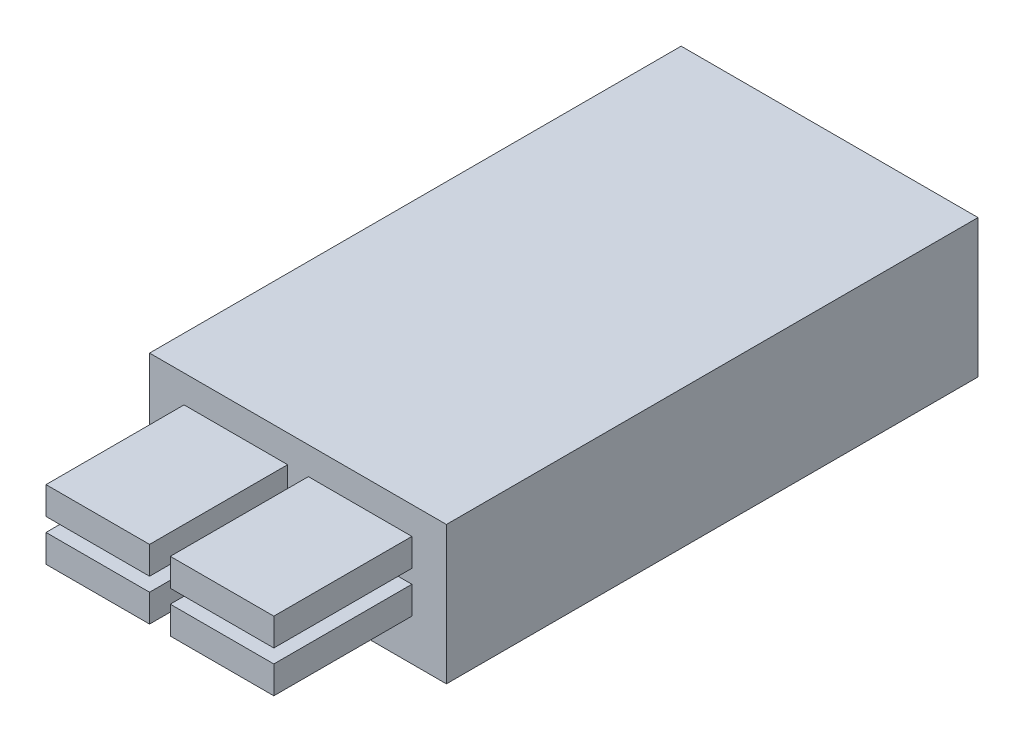
ISO-10303-21;
HEADER;
FILE_DESCRIPTION(('STEP AP214'),'2;1');
FILE_NAME('part.step','',(''),(''),'','','');
FILE_SCHEMA(('AUTOMOTIVE_DESIGN { 1 0 10303 214 1 1 1 1 }'));
ENDSEC;
DATA;
#1=APPLICATION_CONTEXT('core data for automotive mechanical design processes');
#2=APPLICATION_PROTOCOL_DEFINITION('international standard','automotive_design',2000,#1);
#3=PRODUCT_CONTEXT('',#1,'mechanical');
#4=PRODUCT('Part','Part','',(#3));
#5=PRODUCT_RELATED_PRODUCT_CATEGORY('part','',(#4));
#6=PRODUCT_DEFINITION_FORMATION('','',#4);
#7=PRODUCT_DEFINITION_CONTEXT('part definition',#1,'design');
#8=PRODUCT_DEFINITION('design','',#6,#7);
#9=PRODUCT_DEFINITION_SHAPE('','',#8);
#10=(LENGTH_UNIT() NAMED_UNIT(*) SI_UNIT(.MILLI.,.METRE.));
#11=(NAMED_UNIT(*) PLANE_ANGLE_UNIT() SI_UNIT($,.RADIAN.));
#12=(NAMED_UNIT(*) SI_UNIT($,.STERADIAN.) SOLID_ANGLE_UNIT());
#13=UNCERTAINTY_MEASURE_WITH_UNIT(LENGTH_MEASURE(1.E-05),#10,'distance_accuracy_value','');
#14=(GEOMETRIC_REPRESENTATION_CONTEXT(3) GLOBAL_UNCERTAINTY_ASSIGNED_CONTEXT((#13)) GLOBAL_UNIT_ASSIGNED_CONTEXT((#10,
#11,#12)) REPRESENTATION_CONTEXT('',''));
#15=CARTESIAN_POINT('',(0.,0.,0.));
#16=DIRECTION('',(0.,0.,1.));
#17=DIRECTION('',(1.,0.,0.));
#18=AXIS2_PLACEMENT_3D('',#15,#16,#17);
#19=CARTESIAN_POINT('',(-10.75,10.,19.25));
#20=DIRECTION('',(0.,0.,-1.));
#21=DIRECTION('',(-1.,0.,0.));
#22=AXIS2_PLACEMENT_3D('',#19,#20,#21);
#23=PLANE('',#22);
#24=DIRECTION('',(-1.,0.,0.));
#25=VECTOR('',#24,1.);
#26=CARTESIAN_POINT('',(8.25,4.99999999999999,19.25));
#27=LINE('',#26,#25);
#28=CARTESIAN_POINT('',(8.25,4.99999999999999,19.25));
#29=VERTEX_POINT('',#28);
#30=CARTESIAN_POINT('',(0.750000000000006,5.,19.25));
#31=VERTEX_POINT('',#30);
#32=EDGE_CURVE('E190',#29,#31,#27,.T.);
#33=ORIENTED_EDGE('',*,*,#32,.F.);
#34=DIRECTION('',(0.,1.,0.));
#35=VECTOR('',#34,1.);
#36=CARTESIAN_POINT('',(8.25,4.99999999999999,19.25));
#37=LINE('',#36,#35);
#38=CARTESIAN_POINT('',(8.25,2.99999999999999,19.25));
#39=VERTEX_POINT('',#38);
#40=EDGE_CURVE('E203',#39,#29,#37,.T.);
#41=ORIENTED_EDGE('',*,*,#40,.F.);
#42=DIRECTION('',(1.,0.,0.));
#43=VECTOR('',#42,1.);
#44=CARTESIAN_POINT('',(8.25,2.99999999999999,19.25));
#45=LINE('',#44,#43);
#46=CARTESIAN_POINT('',(0.750000000000002,3.,19.25));
#47=VERTEX_POINT('',#46);
#48=EDGE_CURVE('E212',#47,#39,#45,.T.);
#49=ORIENTED_EDGE('',*,*,#48,.F.);
#50=DIRECTION('',(0.,-1.,0.));
#51=VECTOR('',#50,1.);
#52=CARTESIAN_POINT('',(0.750000000000005,5.,19.25));
#53=LINE('',#52,#51);
#54=EDGE_CURVE('E193',#31,#47,#53,.T.);
#55=ORIENTED_EDGE('',*,*,#54,.F.);
#56=EDGE_LOOP('',(#33,#41,#49,#55));
#57=FACE_BOUND('',#56,.T.);
#58=DIRECTION('',(0.,1.,0.));
#59=VECTOR('',#58,1.);
#60=CARTESIAN_POINT('',(-0.75,8.,19.25));
#61=LINE('',#60,#59);
#62=CARTESIAN_POINT('',(-0.75,6.,19.25));
#63=VERTEX_POINT('',#62);
#64=CARTESIAN_POINT('',(-0.749999999999999,8.,19.25));
#65=VERTEX_POINT('',#64);
#66=EDGE_CURVE('E261',#63,#65,#61,.T.);
#67=ORIENTED_EDGE('',*,*,#66,.F.);
#68=DIRECTION('',(1.,0.,0.));
#69=VECTOR('',#68,1.);
#70=CARTESIAN_POINT('',(-8.25,6.,19.25));
#71=LINE('',#70,#69);
#72=CARTESIAN_POINT('',(-8.25,6.,19.25));
#73=VERTEX_POINT('',#72);
#74=EDGE_CURVE('E266',#73,#63,#71,.T.);
#75=ORIENTED_EDGE('',*,*,#74,.F.);
#76=DIRECTION('',(0.,-1.,0.));
#77=VECTOR('',#76,1.);
#78=CARTESIAN_POINT('',(-8.25,8.,19.25));
#79=LINE('',#78,#77);
#80=CARTESIAN_POINT('',(-8.25,8.,19.25));
#81=VERTEX_POINT('',#80);
#82=EDGE_CURVE('E278',#81,#73,#79,.T.);
#83=ORIENTED_EDGE('',*,*,#82,.F.);
#84=DIRECTION('',(-1.,0.,0.));
#85=VECTOR('',#84,1.);
#86=CARTESIAN_POINT('',(-8.25,8.,19.25));
#87=LINE('',#86,#85);
#88=EDGE_CURVE('E275',#65,#81,#87,.T.);
#89=ORIENTED_EDGE('',*,*,#88,.F.);
#90=EDGE_LOOP('',(#67,#75,#83,#89));
#91=FACE_BOUND('',#90,.T.);
#92=DIRECTION('',(1.,0.,0.));
#93=VECTOR('',#92,1.);
#94=CARTESIAN_POINT('',(-10.75,0.,19.25));
#95=LINE('',#94,#93);
#96=CARTESIAN_POINT('',(-10.75,0.,19.25));
#97=VERTEX_POINT('',#96);
#98=CARTESIAN_POINT('',(10.75,0.,19.25));
#99=VERTEX_POINT('',#98);
#100=EDGE_CURVE('E299',#97,#99,#95,.T.);
#101=ORIENTED_EDGE('',*,*,#100,.T.);
#102=DIRECTION('',(0.,-1.,0.));
#103=VECTOR('',#102,1.);
#104=CARTESIAN_POINT('',(10.75,10.,19.25));
#105=LINE('',#104,#103);
#106=CARTESIAN_POINT('',(10.75,10.,19.25));
#107=VERTEX_POINT('',#106);
#108=EDGE_CURVE('E305',#107,#99,#105,.T.);
#109=ORIENTED_EDGE('',*,*,#108,.F.);
#110=DIRECTION('',(1.,0.,0.));
#111=VECTOR('',#110,1.);
#112=CARTESIAN_POINT('',(-10.75,10.,19.25));
#113=LINE('',#112,#111);
#114=CARTESIAN_POINT('',(-10.75,10.,19.25));
#115=VERTEX_POINT('',#114);
#116=EDGE_CURVE('E303',#115,#107,#113,.T.);
#117=ORIENTED_EDGE('',*,*,#116,.F.);
#118=DIRECTION('',(0.,-1.,0.));
#119=VECTOR('',#118,1.);
#120=CARTESIAN_POINT('',(-10.75,10.,19.25));
#121=LINE('',#120,#119);
#122=EDGE_CURVE('E315',#115,#97,#121,.T.);
#123=ORIENTED_EDGE('',*,*,#122,.T.);
#124=EDGE_LOOP('',(#101,#109,#117,#123));
#125=FACE_BOUND('',#124,.T.);
#126=DIRECTION('',(0.,1.,0.));
#127=VECTOR('',#126,1.);
#128=CARTESIAN_POINT('',(-0.75,5.,19.25));
#129=LINE('',#128,#127);
#130=CARTESIAN_POINT('',(-0.75,3.,19.25));
#131=VERTEX_POINT('',#130);
#132=CARTESIAN_POINT('',(-0.749999999999999,5.,19.25));
#133=VERTEX_POINT('',#132);
#134=EDGE_CURVE('E228',#131,#133,#129,.T.);
#135=ORIENTED_EDGE('',*,*,#134,.F.);
#136=DIRECTION('',(1.,0.,0.));
#137=VECTOR('',#136,1.);
#138=CARTESIAN_POINT('',(-8.25,3.,19.25));
#139=LINE('',#138,#137);
#140=CARTESIAN_POINT('',(-8.25,3.,19.25));
#141=VERTEX_POINT('',#140);
#142=EDGE_CURVE('E233',#141,#131,#139,.T.);
#143=ORIENTED_EDGE('',*,*,#142,.F.);
#144=DIRECTION('',(0.,-1.,0.));
#145=VECTOR('',#144,1.);
#146=CARTESIAN_POINT('',(-8.25,5.,19.25));
#147=LINE('',#146,#145);
#148=CARTESIAN_POINT('',(-8.25,5.,19.25));
#149=VERTEX_POINT('',#148);
#150=EDGE_CURVE('E245',#149,#141,#147,.T.);
#151=ORIENTED_EDGE('',*,*,#150,.F.);
#152=DIRECTION('',(-1.,0.,0.));
#153=VECTOR('',#152,1.);
#154=CARTESIAN_POINT('',(-8.25,5.,19.25));
#155=LINE('',#154,#153);
#156=EDGE_CURVE('E242',#133,#149,#155,.T.);
#157=ORIENTED_EDGE('',*,*,#156,.F.);
#158=EDGE_LOOP('',(#135,#143,#151,#157));
#159=FACE_BOUND('',#158,.T.);
#160=DIRECTION('',(-1.,0.,0.));
#161=VECTOR('',#160,1.);
#162=CARTESIAN_POINT('',(8.25000000000001,7.99999999999999,19.25));
#163=LINE('',#162,#161);
#164=CARTESIAN_POINT('',(8.25000000000001,7.99999999999999,19.25));
#165=VERTEX_POINT('',#164);
#166=CARTESIAN_POINT('',(0.750000000000007,8.,19.25));
#167=VERTEX_POINT('',#166);
#168=EDGE_CURVE('E189',#165,#167,#163,.T.);
#169=ORIENTED_EDGE('',*,*,#168,.F.);
#170=DIRECTION('',(0.,1.,0.));
#171=VECTOR('',#170,1.);
#172=CARTESIAN_POINT('',(8.25000000000001,7.99999999999999,19.25));
#173=LINE('',#172,#171);
#174=CARTESIAN_POINT('',(8.25000000000001,5.99999999999999,19.25));
#175=VERTEX_POINT('',#174);
#176=EDGE_CURVE('E186',#175,#165,#173,.T.);
#177=ORIENTED_EDGE('',*,*,#176,.F.);
#178=DIRECTION('',(1.,0.,0.));
#179=VECTOR('',#178,1.);
#180=CARTESIAN_POINT('',(8.25000000000001,5.99999999999999,19.25));
#181=LINE('',#180,#179);
#182=CARTESIAN_POINT('',(0.750000000000006,6.,19.25));
#183=VERTEX_POINT('',#182);
#184=EDGE_CURVE('E52',#183,#175,#181,.T.);
#185=ORIENTED_EDGE('',*,*,#184,.F.);
#186=DIRECTION('',(0.,-1.,0.));
#187=VECTOR('',#186,1.);
#188=CARTESIAN_POINT('',(0.750000000000008,8.,19.25));
#189=LINE('',#188,#187);
#190=EDGE_CURVE('E47',#167,#183,#189,.T.);
#191=ORIENTED_EDGE('',*,*,#190,.F.);
#192=EDGE_LOOP('',(#169,#177,#185,#191));
#193=FACE_BOUND('',#192,.T.);
#194=ADVANCED_FACE('F32',(#57,#91,#125,#159,#193),#23,.F.);
#195=CARTESIAN_POINT('',(10.75,10.,-19.25));
#196=DIRECTION('',(-1.,0.,0.));
#197=DIRECTION('',(0.,0.,1.));
#198=AXIS2_PLACEMENT_3D('',#195,#196,#197);
#199=PLANE('',#198);
#200=DIRECTION('',(0.,0.,-1.));
#201=VECTOR('',#200,1.);
#202=CARTESIAN_POINT('',(10.75,0.,-19.25));
#203=LINE('',#202,#201);
#204=CARTESIAN_POINT('',(10.75,0.,-19.25));
#205=VERTEX_POINT('',#204);
#206=EDGE_CURVE('E294',#99,#205,#203,.T.);
#207=ORIENTED_EDGE('',*,*,#206,.T.);
#208=DIRECTION('',(0.,-1.,0.));
#209=VECTOR('',#208,1.);
#210=CARTESIAN_POINT('',(10.75,10.,-19.25));
#211=LINE('',#210,#209);
#212=CARTESIAN_POINT('',(10.75,10.,-19.25));
#213=VERTEX_POINT('',#212);
#214=EDGE_CURVE('E11',#213,#205,#211,.T.);
#215=ORIENTED_EDGE('',*,*,#214,.F.);
#216=DIRECTION('',(0.,0.,-1.));
#217=VECTOR('',#216,1.);
#218=CARTESIAN_POINT('',(10.75,10.,-19.25));
#219=LINE('',#218,#217);
#220=EDGE_CURVE('E295',#107,#213,#219,.T.);
#221=ORIENTED_EDGE('',*,*,#220,.F.);
#222=ORIENTED_EDGE('',*,*,#108,.T.);
#223=EDGE_LOOP('',(#207,#215,#221,#222));
#224=FACE_BOUND('',#223,.T.);
#225=ADVANCED_FACE('F34',(#224),#199,.F.);
#226=CARTESIAN_POINT('',(-10.75,10.,-19.25));
#227=DIRECTION('',(0.,0.,1.));
#228=DIRECTION('',(1.,0.,0.));
#229=AXIS2_PLACEMENT_3D('',#226,#227,#228);
#230=PLANE('',#229);
#231=DIRECTION('',(-1.,0.,0.));
#232=VECTOR('',#231,1.);
#233=CARTESIAN_POINT('',(-10.75,0.,-19.25));
#234=LINE('',#233,#232);
#235=CARTESIAN_POINT('',(-10.75,0.,-19.25));
#236=VERTEX_POINT('',#235);
#237=EDGE_CURVE('E308',#205,#236,#234,.T.);
#238=ORIENTED_EDGE('',*,*,#237,.T.);
#239=DIRECTION('',(0.,-1.,0.));
#240=VECTOR('',#239,1.);
#241=CARTESIAN_POINT('',(-10.75,10.,-19.25));
#242=LINE('',#241,#240);
#243=CARTESIAN_POINT('',(-10.75,10.,-19.25));
#244=VERTEX_POINT('',#243);
#245=EDGE_CURVE('E40',#244,#236,#242,.T.);
#246=ORIENTED_EDGE('',*,*,#245,.F.);
#247=DIRECTION('',(-1.,0.,0.));
#248=VECTOR('',#247,1.);
#249=CARTESIAN_POINT('',(-10.75,10.,-19.25));
#250=LINE('',#249,#248);
#251=EDGE_CURVE('E298',#213,#244,#250,.T.);
#252=ORIENTED_EDGE('',*,*,#251,.F.);
#253=ORIENTED_EDGE('',*,*,#214,.T.);
#254=EDGE_LOOP('',(#238,#246,#252,#253));
#255=FACE_BOUND('',#254,.T.);
#256=ADVANCED_FACE('F338',(#255),#230,.F.);
#257=CARTESIAN_POINT('',(-10.75,10.,-19.25));
#258=DIRECTION('',(1.,0.,0.));
#259=DIRECTION('',(0.,0.,-1.));
#260=AXIS2_PLACEMENT_3D('',#257,#258,#259);
#261=PLANE('',#260);
#262=DIRECTION('',(0.,0.,1.));
#263=VECTOR('',#262,1.);
#264=CARTESIAN_POINT('',(-10.75,0.,-19.25));
#265=LINE('',#264,#263);
#266=EDGE_CURVE('E310',#236,#97,#265,.T.);
#267=ORIENTED_EDGE('',*,*,#266,.T.);
#268=ORIENTED_EDGE('',*,*,#122,.F.);
#269=DIRECTION('',(0.,0.,1.));
#270=VECTOR('',#269,1.);
#271=CARTESIAN_POINT('',(-10.75,10.,-19.25));
#272=LINE('',#271,#270);
#273=EDGE_CURVE('E301',#244,#115,#272,.T.);
#274=ORIENTED_EDGE('',*,*,#273,.F.);
#275=ORIENTED_EDGE('',*,*,#245,.T.);
#276=EDGE_LOOP('',(#267,#268,#274,#275));
#277=FACE_BOUND('',#276,.T.);
#278=ADVANCED_FACE('F322',(#277),#261,.F.);
#279=CARTESIAN_POINT('',(0.,10.,0.));
#280=DIRECTION('',(0.,1.,0.));
#281=DIRECTION('',(0.,0.,1.));
#282=AXIS2_PLACEMENT_3D('',#279,#280,#281);
#283=PLANE('',#282);
#284=ORIENTED_EDGE('',*,*,#220,.T.);
#285=ORIENTED_EDGE('',*,*,#251,.T.);
#286=ORIENTED_EDGE('',*,*,#273,.T.);
#287=ORIENTED_EDGE('',*,*,#116,.T.);
#288=EDGE_LOOP('',(#284,#285,#286,#287));
#289=FACE_BOUND('',#288,.T.);
#290=ADVANCED_FACE('F337',(#289),#283,.T.);
#291=CARTESIAN_POINT('',(0.,0.,0.));
#292=DIRECTION('',(0.,1.,0.));
#293=DIRECTION('',(0.,0.,1.));
#294=AXIS2_PLACEMENT_3D('',#291,#292,#293);
#295=PLANE('',#294);
#296=ORIENTED_EDGE('',*,*,#206,.F.);
#297=ORIENTED_EDGE('',*,*,#100,.F.);
#298=ORIENTED_EDGE('',*,*,#266,.F.);
#299=ORIENTED_EDGE('',*,*,#237,.F.);
#300=EDGE_LOOP('',(#296,#297,#298,#299));
#301=FACE_BOUND('',#300,.T.);
#302=ADVANCED_FACE('F328',(#301),#295,.F.);
#303=CARTESIAN_POINT('',(-0.75,8.,29.25));
#304=DIRECTION('',(-1.,0.,0.));
#305=DIRECTION('',(0.,0.,1.));
#306=AXIS2_PLACEMENT_3D('',#303,#304,#305);
#307=PLANE('',#306);
#308=ORIENTED_EDGE('',*,*,#66,.T.);
#309=DIRECTION('',(0.,0.,-1.));
#310=VECTOR('',#309,1.);
#311=CARTESIAN_POINT('',(-0.75,8.,29.25));
#312=LINE('',#311,#310);
#313=CARTESIAN_POINT('',(-0.75,8.,29.25));
#314=VERTEX_POINT('',#313);
#315=EDGE_CURVE('E291',#314,#65,#312,.T.);
#316=ORIENTED_EDGE('',*,*,#315,.F.);
#317=DIRECTION('',(0.,1.,0.));
#318=VECTOR('',#317,1.);
#319=CARTESIAN_POINT('',(-0.75,8.,29.25));
#320=LINE('',#319,#318);
#321=CARTESIAN_POINT('',(-0.75,6.,29.25));
#322=VERTEX_POINT('',#321);
#323=EDGE_CURVE('E262',#322,#314,#320,.T.);
#324=ORIENTED_EDGE('',*,*,#323,.F.);
#325=DIRECTION('',(0.,0.,-1.));
#326=VECTOR('',#325,1.);
#327=CARTESIAN_POINT('',(-0.75,6.,29.25));
#328=LINE('',#327,#326);
#329=EDGE_CURVE('E272',#322,#63,#328,.T.);
#330=ORIENTED_EDGE('',*,*,#329,.T.);
#331=EDGE_LOOP('',(#308,#316,#324,#330));
#332=FACE_BOUND('',#331,.T.);
#333=ADVANCED_FACE('F354',(#332),#307,.F.);
#334=CARTESIAN_POINT('',(-8.25,8.,29.25));
#335=DIRECTION('',(0.,-1.,0.));
#336=DIRECTION('',(0.,0.,-1.));
#337=AXIS2_PLACEMENT_3D('',#334,#335,#336);
#338=PLANE('',#337);
#339=ORIENTED_EDGE('',*,*,#88,.T.);
#340=DIRECTION('',(0.,0.,-1.));
#341=VECTOR('',#340,1.);
#342=CARTESIAN_POINT('',(-8.25,8.,29.25));
#343=LINE('',#342,#341);
#344=CARTESIAN_POINT('',(-8.25,8.,29.25));
#345=VERTEX_POINT('',#344);
#346=EDGE_CURVE('E288',#345,#81,#343,.T.);
#347=ORIENTED_EDGE('',*,*,#346,.F.);
#348=DIRECTION('',(-1.,0.,0.));
#349=VECTOR('',#348,1.);
#350=CARTESIAN_POINT('',(-8.25,8.,29.25));
#351=LINE('',#350,#349);
#352=EDGE_CURVE('E265',#314,#345,#351,.T.);
#353=ORIENTED_EDGE('',*,*,#352,.F.);
#354=ORIENTED_EDGE('',*,*,#315,.T.);
#355=EDGE_LOOP('',(#339,#347,#353,#354));
#356=FACE_BOUND('',#355,.T.);
#357=ADVANCED_FACE('F359',(#356),#338,.F.);
#358=CARTESIAN_POINT('',(-8.25,8.,29.25));
#359=DIRECTION('',(1.,0.,0.));
#360=DIRECTION('',(0.,0.,-1.));
#361=AXIS2_PLACEMENT_3D('',#358,#359,#360);
#362=PLANE('',#361);
#363=ORIENTED_EDGE('',*,*,#82,.T.);
#364=DIRECTION('',(0.,0.,-1.));
#365=VECTOR('',#364,1.);
#366=CARTESIAN_POINT('',(-8.25,6.,29.25));
#367=LINE('',#366,#365);
#368=CARTESIAN_POINT('',(-8.25,6.,29.25));
#369=VERTEX_POINT('',#368);
#370=EDGE_CURVE('E285',#369,#73,#367,.T.);
#371=ORIENTED_EDGE('',*,*,#370,.F.);
#372=DIRECTION('',(0.,-1.,0.));
#373=VECTOR('',#372,1.);
#374=CARTESIAN_POINT('',(-8.25,8.,29.25));
#375=LINE('',#374,#373);
#376=EDGE_CURVE('E268',#345,#369,#375,.T.);
#377=ORIENTED_EDGE('',*,*,#376,.F.);
#378=ORIENTED_EDGE('',*,*,#346,.T.);
#379=EDGE_LOOP('',(#363,#371,#377,#378));
#380=FACE_BOUND('',#379,.T.);
#381=ADVANCED_FACE('F363',(#380),#362,.F.);
#382=CARTESIAN_POINT('',(-8.25,6.,29.25));
#383=DIRECTION('',(0.,1.,0.));
#384=DIRECTION('',(0.,0.,1.));
#385=AXIS2_PLACEMENT_3D('',#382,#383,#384);
#386=PLANE('',#385);
#387=ORIENTED_EDGE('',*,*,#74,.T.);
#388=ORIENTED_EDGE('',*,*,#329,.F.);
#389=DIRECTION('',(1.,0.,0.));
#390=VECTOR('',#389,1.);
#391=CARTESIAN_POINT('',(-8.25,6.,29.25));
#392=LINE('',#391,#390);
#393=EDGE_CURVE('E270',#369,#322,#392,.T.);
#394=ORIENTED_EDGE('',*,*,#393,.F.);
#395=ORIENTED_EDGE('',*,*,#370,.T.);
#396=EDGE_LOOP('',(#387,#388,#394,#395));
#397=FACE_BOUND('',#396,.T.);
#398=ADVANCED_FACE('F367',(#397),#386,.F.);
#399=CARTESIAN_POINT('',(0.,0.,29.25));
#400=DIRECTION('',(0.,0.,1.));
#401=DIRECTION('',(1.,0.,0.));
#402=AXIS2_PLACEMENT_3D('',#399,#400,#401);
#403=PLANE('',#402);
#404=ORIENTED_EDGE('',*,*,#323,.T.);
#405=ORIENTED_EDGE('',*,*,#352,.T.);
#406=ORIENTED_EDGE('',*,*,#376,.T.);
#407=ORIENTED_EDGE('',*,*,#393,.T.);
#408=EDGE_LOOP('',(#404,#405,#406,#407));
#409=FACE_BOUND('',#408,.T.);
#410=ADVANCED_FACE('F371',(#409),#403,.T.);
#411=CARTESIAN_POINT('',(-0.75,5.,29.25));
#412=DIRECTION('',(-1.,0.,0.));
#413=DIRECTION('',(0.,0.,1.));
#414=AXIS2_PLACEMENT_3D('',#411,#412,#413);
#415=PLANE('',#414);
#416=ORIENTED_EDGE('',*,*,#134,.T.);
#417=DIRECTION('',(0.,0.,-1.));
#418=VECTOR('',#417,1.);
#419=CARTESIAN_POINT('',(-0.75,5.,29.25));
#420=LINE('',#419,#418);
#421=CARTESIAN_POINT('',(-0.75,5.,29.25));
#422=VERTEX_POINT('',#421);
#423=EDGE_CURVE('E258',#422,#133,#420,.T.);
#424=ORIENTED_EDGE('',*,*,#423,.F.);
#425=DIRECTION('',(0.,1.,0.));
#426=VECTOR('',#425,1.);
#427=CARTESIAN_POINT('',(-0.75,5.,29.25));
#428=LINE('',#427,#426);
#429=CARTESIAN_POINT('',(-0.75,3.,29.25));
#430=VERTEX_POINT('',#429);
#431=EDGE_CURVE('E229',#430,#422,#428,.T.);
#432=ORIENTED_EDGE('',*,*,#431,.F.);
#433=DIRECTION('',(0.,0.,-1.));
#434=VECTOR('',#433,1.);
#435=CARTESIAN_POINT('',(-0.75,3.,29.25));
#436=LINE('',#435,#434);
#437=EDGE_CURVE('E239',#430,#131,#436,.T.);
#438=ORIENTED_EDGE('',*,*,#437,.T.);
#439=EDGE_LOOP('',(#416,#424,#432,#438));
#440=FACE_BOUND('',#439,.T.);
#441=ADVANCED_FACE('F375',(#440),#415,.F.);
#442=CARTESIAN_POINT('',(-8.25,5.,29.25));
#443=DIRECTION('',(0.,-1.,0.));
#444=DIRECTION('',(0.,0.,-1.));
#445=AXIS2_PLACEMENT_3D('',#442,#443,#444);
#446=PLANE('',#445);
#447=ORIENTED_EDGE('',*,*,#156,.T.);
#448=DIRECTION('',(0.,0.,-1.));
#449=VECTOR('',#448,1.);
#450=CARTESIAN_POINT('',(-8.25,5.,29.25));
#451=LINE('',#450,#449);
#452=CARTESIAN_POINT('',(-8.25,5.,29.25));
#453=VERTEX_POINT('',#452);
#454=EDGE_CURVE('E255',#453,#149,#451,.T.);
#455=ORIENTED_EDGE('',*,*,#454,.F.);
#456=DIRECTION('',(-1.,0.,0.));
#457=VECTOR('',#456,1.);
#458=CARTESIAN_POINT('',(-8.25,5.,29.25));
#459=LINE('',#458,#457);
#460=EDGE_CURVE('E232',#422,#453,#459,.T.);
#461=ORIENTED_EDGE('',*,*,#460,.F.);
#462=ORIENTED_EDGE('',*,*,#423,.T.);
#463=EDGE_LOOP('',(#447,#455,#461,#462));
#464=FACE_BOUND('',#463,.T.);
#465=ADVANCED_FACE('F379',(#464),#446,.F.);
#466=CARTESIAN_POINT('',(-8.25,5.,29.25));
#467=DIRECTION('',(1.,0.,0.));
#468=DIRECTION('',(0.,0.,-1.));
#469=AXIS2_PLACEMENT_3D('',#466,#467,#468);
#470=PLANE('',#469);
#471=ORIENTED_EDGE('',*,*,#150,.T.);
#472=DIRECTION('',(0.,0.,-1.));
#473=VECTOR('',#472,1.);
#474=CARTESIAN_POINT('',(-8.25,3.,29.25));
#475=LINE('',#474,#473);
#476=CARTESIAN_POINT('',(-8.25,3.,29.25));
#477=VERTEX_POINT('',#476);
#478=EDGE_CURVE('E252',#477,#141,#475,.T.);
#479=ORIENTED_EDGE('',*,*,#478,.F.);
#480=DIRECTION('',(0.,-1.,0.));
#481=VECTOR('',#480,1.);
#482=CARTESIAN_POINT('',(-8.25,5.,29.25));
#483=LINE('',#482,#481);
#484=EDGE_CURVE('E235',#453,#477,#483,.T.);
#485=ORIENTED_EDGE('',*,*,#484,.F.);
#486=ORIENTED_EDGE('',*,*,#454,.T.);
#487=EDGE_LOOP('',(#471,#479,#485,#486));
#488=FACE_BOUND('',#487,.T.);
#489=ADVANCED_FACE('F383',(#488),#470,.F.);
#490=CARTESIAN_POINT('',(-8.25,3.,29.25));
#491=DIRECTION('',(0.,1.,0.));
#492=DIRECTION('',(0.,0.,1.));
#493=AXIS2_PLACEMENT_3D('',#490,#491,#492);
#494=PLANE('',#493);
#495=ORIENTED_EDGE('',*,*,#142,.T.);
#496=ORIENTED_EDGE('',*,*,#437,.F.);
#497=DIRECTION('',(1.,0.,0.));
#498=VECTOR('',#497,1.);
#499=CARTESIAN_POINT('',(-8.25,3.,29.25));
#500=LINE('',#499,#498);
#501=EDGE_CURVE('E237',#477,#430,#500,.T.);
#502=ORIENTED_EDGE('',*,*,#501,.F.);
#503=ORIENTED_EDGE('',*,*,#478,.T.);
#504=EDGE_LOOP('',(#495,#496,#502,#503));
#505=FACE_BOUND('',#504,.T.);
#506=ADVANCED_FACE('F387',(#505),#494,.F.);
#507=CARTESIAN_POINT('',(0.,0.,29.25));
#508=DIRECTION('',(0.,0.,1.));
#509=DIRECTION('',(1.,0.,0.));
#510=AXIS2_PLACEMENT_3D('',#507,#508,#509);
#511=PLANE('',#510);
#512=ORIENTED_EDGE('',*,*,#431,.T.);
#513=ORIENTED_EDGE('',*,*,#460,.T.);
#514=ORIENTED_EDGE('',*,*,#484,.T.);
#515=ORIENTED_EDGE('',*,*,#501,.T.);
#516=EDGE_LOOP('',(#512,#513,#514,#515));
#517=FACE_BOUND('',#516,.T.);
#518=ADVANCED_FACE('F391',(#517),#511,.T.);
#519=CARTESIAN_POINT('',(8.25,4.99999999999999,29.25));
#520=DIRECTION('',(0.,-1.,0.));
#521=DIRECTION('',(1.,0.,0.));
#522=AXIS2_PLACEMENT_3D('',#519,#520,#521);
#523=PLANE('',#522);
#524=ORIENTED_EDGE('',*,*,#32,.T.);
#525=DIRECTION('',(0.,0.,-1.));
#526=VECTOR('',#525,1.);
#527=CARTESIAN_POINT('',(0.750000000000005,5.,29.25));
#528=LINE('',#527,#526);
#529=CARTESIAN_POINT('',(0.750000000000005,5.,29.25));
#530=VERTEX_POINT('',#529);
#531=EDGE_CURVE('E225',#530,#31,#528,.T.);
#532=ORIENTED_EDGE('',*,*,#531,.F.);
#533=DIRECTION('',(-1.,0.,0.));
#534=VECTOR('',#533,1.);
#535=CARTESIAN_POINT('',(8.25,4.99999999999999,29.25));
#536=LINE('',#535,#534);
#537=CARTESIAN_POINT('',(8.25,4.99999999999999,29.25));
#538=VERTEX_POINT('',#537);
#539=EDGE_CURVE('E199',#538,#530,#536,.T.);
#540=ORIENTED_EDGE('',*,*,#539,.F.);
#541=DIRECTION('',(0.,0.,-1.));
#542=VECTOR('',#541,1.);
#543=CARTESIAN_POINT('',(8.25,4.99999999999999,29.25));
#544=LINE('',#543,#542);
#545=EDGE_CURVE('E208',#538,#29,#544,.T.);
#546=ORIENTED_EDGE('',*,*,#545,.T.);
#547=EDGE_LOOP('',(#524,#532,#540,#546));
#548=FACE_BOUND('',#547,.T.);
#549=ADVANCED_FACE('F395',(#548),#523,.F.);
#550=CARTESIAN_POINT('',(0.750000000000005,5.,29.25));
#551=DIRECTION('',(1.,0.,0.));
#552=DIRECTION('',(0.,1.,0.));
#553=AXIS2_PLACEMENT_3D('',#550,#551,#552);
#554=PLANE('',#553);
#555=ORIENTED_EDGE('',*,*,#54,.T.);
#556=DIRECTION('',(0.,0.,-1.));
#557=VECTOR('',#556,1.);
#558=CARTESIAN_POINT('',(0.750000000000003,3.,29.25));
#559=LINE('',#558,#557);
#560=CARTESIAN_POINT('',(0.750000000000003,3.,29.25));
#561=VERTEX_POINT('',#560);
#562=EDGE_CURVE('E222',#561,#47,#559,.T.);
#563=ORIENTED_EDGE('',*,*,#562,.F.);
#564=DIRECTION('',(0.,-1.,0.));
#565=VECTOR('',#564,1.);
#566=CARTESIAN_POINT('',(0.750000000000005,5.,29.25));
#567=LINE('',#566,#565);
#568=EDGE_CURVE('E202',#530,#561,#567,.T.);
#569=ORIENTED_EDGE('',*,*,#568,.F.);
#570=ORIENTED_EDGE('',*,*,#531,.T.);
#571=EDGE_LOOP('',(#555,#563,#569,#570));
#572=FACE_BOUND('',#571,.T.);
#573=ADVANCED_FACE('F399',(#572),#554,.F.);
#574=CARTESIAN_POINT('',(8.25,2.99999999999999,29.25));
#575=DIRECTION('',(0.,1.,0.));
#576=DIRECTION('',(-1.,0.,0.));
#577=AXIS2_PLACEMENT_3D('',#574,#575,#576);
#578=PLANE('',#577);
#579=ORIENTED_EDGE('',*,*,#48,.T.);
#580=DIRECTION('',(0.,0.,-1.));
#581=VECTOR('',#580,1.);
#582=CARTESIAN_POINT('',(8.25,2.99999999999999,29.25));
#583=LINE('',#582,#581);
#584=CARTESIAN_POINT('',(8.25,2.99999999999999,29.25));
#585=VERTEX_POINT('',#584);
#586=EDGE_CURVE('E219',#585,#39,#583,.T.);
#587=ORIENTED_EDGE('',*,*,#586,.F.);
#588=DIRECTION('',(1.,0.,0.));
#589=VECTOR('',#588,1.);
#590=CARTESIAN_POINT('',(8.25,2.99999999999999,29.25));
#591=LINE('',#590,#589);
#592=EDGE_CURVE('E205',#561,#585,#591,.T.);
#593=ORIENTED_EDGE('',*,*,#592,.F.);
#594=ORIENTED_EDGE('',*,*,#562,.T.);
#595=EDGE_LOOP('',(#579,#587,#593,#594));
#596=FACE_BOUND('',#595,.T.);
#597=ADVANCED_FACE('F403',(#596),#578,.F.);
#598=CARTESIAN_POINT('',(8.25,4.99999999999999,29.25));
#599=DIRECTION('',(-1.,0.,0.));
#600=DIRECTION('',(0.,0.,1.));
#601=AXIS2_PLACEMENT_3D('',#598,#599,#600);
#602=PLANE('',#601);
#603=ORIENTED_EDGE('',*,*,#40,.T.);
#604=ORIENTED_EDGE('',*,*,#545,.F.);
#605=DIRECTION('',(0.,1.,0.));
#606=VECTOR('',#605,1.);
#607=CARTESIAN_POINT('',(8.25,4.99999999999999,29.25));
#608=LINE('',#607,#606);
#609=EDGE_CURVE('E207',#585,#538,#608,.T.);
#610=ORIENTED_EDGE('',*,*,#609,.F.);
#611=ORIENTED_EDGE('',*,*,#586,.T.);
#612=EDGE_LOOP('',(#603,#604,#610,#611));
#613=FACE_BOUND('',#612,.T.);
#614=ADVANCED_FACE('F407',(#613),#602,.F.);
#615=CARTESIAN_POINT('',(0.,0.,29.25));
#616=DIRECTION('',(0.,0.,1.));
#617=DIRECTION('',(1.,0.,0.));
#618=AXIS2_PLACEMENT_3D('',#615,#616,#617);
#619=PLANE('',#618);
#620=ORIENTED_EDGE('',*,*,#539,.T.);
#621=ORIENTED_EDGE('',*,*,#568,.T.);
#622=ORIENTED_EDGE('',*,*,#592,.T.);
#623=ORIENTED_EDGE('',*,*,#609,.T.);
#624=EDGE_LOOP('',(#620,#621,#622,#623));
#625=FACE_BOUND('',#624,.T.);
#626=ADVANCED_FACE('F411',(#625),#619,.T.);
#627=CARTESIAN_POINT('',(8.25000000000001,7.99999999999999,29.25));
#628=DIRECTION('',(0.,-1.,0.));
#629=DIRECTION('',(1.,0.,0.));
#630=AXIS2_PLACEMENT_3D('',#627,#628,#629);
#631=PLANE('',#630);
#632=ORIENTED_EDGE('',*,*,#168,.T.);
#633=DIRECTION('',(0.,0.,-1.));
#634=VECTOR('',#633,1.);
#635=CARTESIAN_POINT('',(0.750000000000008,8.,29.25));
#636=LINE('',#635,#634);
#637=CARTESIAN_POINT('',(0.750000000000008,8.,29.25));
#638=VERTEX_POINT('',#637);
#639=EDGE_CURVE('E170',#638,#167,#636,.T.);
#640=ORIENTED_EDGE('',*,*,#639,.F.);
#641=DIRECTION('',(-1.,0.,0.));
#642=VECTOR('',#641,1.);
#643=CARTESIAN_POINT('',(8.25000000000001,7.99999999999999,29.25));
#644=LINE('',#643,#642);
#645=CARTESIAN_POINT('',(8.25000000000001,7.99999999999999,29.25));
#646=VERTEX_POINT('',#645);
#647=EDGE_CURVE('E177',#646,#638,#644,.T.);
#648=ORIENTED_EDGE('',*,*,#647,.F.);
#649=DIRECTION('',(0.,0.,-1.));
#650=VECTOR('',#649,1.);
#651=CARTESIAN_POINT('',(8.25000000000001,7.99999999999999,29.25));
#652=LINE('',#651,#650);
#653=EDGE_CURVE('E583',#646,#165,#652,.T.);
#654=ORIENTED_EDGE('',*,*,#653,.T.);
#655=EDGE_LOOP('',(#632,#640,#648,#654));
#656=FACE_BOUND('',#655,.T.);
#657=ADVANCED_FACE('F188',(#656),#631,.F.);
#658=CARTESIAN_POINT('',(0.750000000000008,8.,29.25));
#659=DIRECTION('',(1.,0.,0.));
#660=DIRECTION('',(0.,1.,0.));
#661=AXIS2_PLACEMENT_3D('',#658,#659,#660);
#662=PLANE('',#661);
#663=ORIENTED_EDGE('',*,*,#190,.T.);
#664=DIRECTION('',(0.,0.,-1.));
#665=VECTOR('',#664,1.);
#666=CARTESIAN_POINT('',(0.750000000000006,6.,29.25));
#667=LINE('',#666,#665);
#668=CARTESIAN_POINT('',(0.750000000000006,6.,29.25));
#669=VERTEX_POINT('',#668);
#670=EDGE_CURVE('E173',#669,#183,#667,.T.);
#671=ORIENTED_EDGE('',*,*,#670,.F.);
#672=DIRECTION('',(0.,-1.,0.));
#673=VECTOR('',#672,1.);
#674=CARTESIAN_POINT('',(0.750000000000008,8.,29.25));
#675=LINE('',#674,#673);
#676=EDGE_CURVE('E166',#638,#669,#675,.T.);
#677=ORIENTED_EDGE('',*,*,#676,.F.);
#678=ORIENTED_EDGE('',*,*,#639,.T.);
#679=EDGE_LOOP('',(#663,#671,#677,#678));
#680=FACE_BOUND('',#679,.T.);
#681=ADVANCED_FACE('F168',(#680),#662,.F.);
#682=CARTESIAN_POINT('',(8.25000000000001,5.99999999999999,29.25));
#683=DIRECTION('',(0.,1.,0.));
#684=DIRECTION('',(-1.,0.,0.));
#685=AXIS2_PLACEMENT_3D('',#682,#683,#684);
#686=PLANE('',#685);
#687=ORIENTED_EDGE('',*,*,#184,.T.);
#688=DIRECTION('',(0.,0.,-1.));
#689=VECTOR('',#688,1.);
#690=CARTESIAN_POINT('',(8.25000000000001,5.99999999999999,29.25));
#691=LINE('',#690,#689);
#692=CARTESIAN_POINT('',(8.25000000000001,5.99999999999999,29.25));
#693=VERTEX_POINT('',#692);
#694=EDGE_CURVE('E195',#693,#175,#691,.T.);
#695=ORIENTED_EDGE('',*,*,#694,.F.);
#696=DIRECTION('',(1.,0.,0.));
#697=VECTOR('',#696,1.);
#698=CARTESIAN_POINT('',(8.25000000000001,5.99999999999999,29.25));
#699=LINE('',#698,#697);
#700=EDGE_CURVE('E176',#669,#693,#699,.T.);
#701=ORIENTED_EDGE('',*,*,#700,.F.);
#702=ORIENTED_EDGE('',*,*,#670,.T.);
#703=EDGE_LOOP('',(#687,#695,#701,#702));
#704=FACE_BOUND('',#703,.T.);
#705=ADVANCED_FACE('F420',(#704),#686,.F.);
#706=CARTESIAN_POINT('',(8.25000000000001,7.99999999999999,29.25));
#707=DIRECTION('',(-1.,0.,0.));
#708=DIRECTION('',(0.,0.,1.));
#709=AXIS2_PLACEMENT_3D('',#706,#707,#708);
#710=PLANE('',#709);
#711=ORIENTED_EDGE('',*,*,#176,.T.);
#712=ORIENTED_EDGE('',*,*,#653,.F.);
#713=DIRECTION('',(0.,1.,0.));
#714=VECTOR('',#713,1.);
#715=CARTESIAN_POINT('',(8.25000000000001,7.99999999999999,29.25));
#716=LINE('',#715,#714);
#717=EDGE_CURVE('E182',#693,#646,#716,.T.);
#718=ORIENTED_EDGE('',*,*,#717,.F.);
#719=ORIENTED_EDGE('',*,*,#694,.T.);
#720=EDGE_LOOP('',(#711,#712,#718,#719));
#721=FACE_BOUND('',#720,.T.);
#722=ADVANCED_FACE('F423',(#721),#710,.F.);
#723=CARTESIAN_POINT('',(0.,0.,29.25));
#724=DIRECTION('',(0.,0.,1.));
#725=DIRECTION('',(1.,0.,0.));
#726=AXIS2_PLACEMENT_3D('',#723,#724,#725);
#727=PLANE('',#726);
#728=ORIENTED_EDGE('',*,*,#647,.T.);
#729=ORIENTED_EDGE('',*,*,#676,.T.);
#730=ORIENTED_EDGE('',*,*,#700,.T.);
#731=ORIENTED_EDGE('',*,*,#717,.T.);
#732=EDGE_LOOP('',(#728,#729,#730,#731));
#733=FACE_BOUND('',#732,.T.);
#734=ADVANCED_FACE('F180',(#733),#727,.T.);
#735=CLOSED_SHELL('',(#194,#225,#256,#278,#290,#302,#333,#357,#381,#398,#410,#441,#465,#489,
#506,#518,#549,#573,#597,#614,#626,#657,#681,#705,#722,#734));
#736=MANIFOLD_SOLID_BREP('B2',#735);
#737=ADVANCED_BREP_SHAPE_REPRESENTATION('',(#18,#736),#14);
#738=SHAPE_DEFINITION_REPRESENTATION(#9,#737);
ENDSEC;
END-ISO-10303-21;
